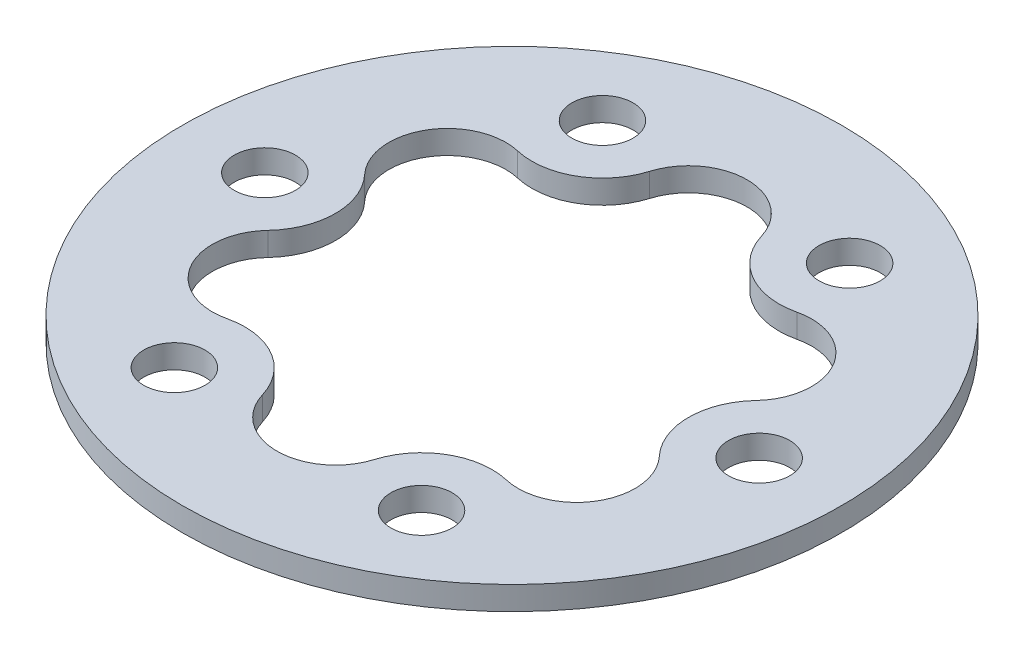
ISO-10303-21;
HEADER;
FILE_DESCRIPTION(('STEP AP214'),'2;1');
FILE_NAME('part.step','',(''),(''),'','','');
FILE_SCHEMA(('AUTOMOTIVE_DESIGN { 1 0 10303 214 1 1 1 1 }'));
ENDSEC;
DATA;
#1=APPLICATION_CONTEXT('core data for automotive mechanical design processes');
#2=APPLICATION_PROTOCOL_DEFINITION('international standard','automotive_design',2000,#1);
#3=PRODUCT_CONTEXT('',#1,'mechanical');
#4=PRODUCT('Part','Part','',(#3));
#5=PRODUCT_RELATED_PRODUCT_CATEGORY('part','',(#4));
#6=PRODUCT_DEFINITION_FORMATION('','',#4);
#7=PRODUCT_DEFINITION_CONTEXT('part definition',#1,'design');
#8=PRODUCT_DEFINITION('design','',#6,#7);
#9=PRODUCT_DEFINITION_SHAPE('','',#8);
#10=(LENGTH_UNIT() NAMED_UNIT(*) SI_UNIT(.MILLI.,.METRE.));
#11=(NAMED_UNIT(*) PLANE_ANGLE_UNIT() SI_UNIT($,.RADIAN.));
#12=(NAMED_UNIT(*) SI_UNIT($,.STERADIAN.) SOLID_ANGLE_UNIT());
#13=UNCERTAINTY_MEASURE_WITH_UNIT(LENGTH_MEASURE(1.E-05),#10,'distance_accuracy_value','');
#14=(GEOMETRIC_REPRESENTATION_CONTEXT(3) GLOBAL_UNCERTAINTY_ASSIGNED_CONTEXT((#13)) GLOBAL_UNIT_ASSIGNED_CONTEXT((#10,
#11,#12)) REPRESENTATION_CONTEXT('',''));
#15=CARTESIAN_POINT('',(0.,0.,0.));
#16=DIRECTION('',(0.,0.,1.));
#17=DIRECTION('',(1.,0.,0.));
#18=AXIS2_PLACEMENT_3D('',#15,#16,#17);
#19=CARTESIAN_POINT('',(0.,2.,0.));
#20=DIRECTION('',(0.,1.,0.));
#21=DIRECTION('',(0.,0.,1.));
#22=AXIS2_PLACEMENT_3D('',#19,#20,#21);
#23=PLANE('',#22);
#24=CARTESIAN_POINT('',(-10.5000000000001,2.,-18.1865334794733));
#25=DIRECTION('',(0.,1.,0.));
#26=DIRECTION('',(0.,0.,1.));
#27=AXIS2_PLACEMENT_3D('',#24,#25,#26);
#28=CIRCLE('',#27,2.6);
#29=CARTESIAN_POINT('',(-10.5000000000001,2.,-15.5865334794733));
#30=VERTEX_POINT('',#29);
#31=EDGE_CURVE('E230',#30,#30,#28,.T.);
#32=ORIENTED_EDGE('',*,*,#31,.F.);
#33=EDGE_LOOP('',(#32));
#34=FACE_BOUND('',#33,.T.);
#35=CARTESIAN_POINT('',(-10.5000000000001,2.,18.1865334794731));
#36=DIRECTION('',(0.,1.,0.));
#37=DIRECTION('',(0.,0.,1.));
#38=AXIS2_PLACEMENT_3D('',#35,#36,#37);
#39=CIRCLE('',#38,2.6);
#40=CARTESIAN_POINT('',(-10.5000000000001,2.,20.7865334794731));
#41=VERTEX_POINT('',#40);
#42=EDGE_CURVE('E242',#41,#41,#39,.T.);
#43=ORIENTED_EDGE('',*,*,#42,.F.);
#44=EDGE_LOOP('',(#43));
#45=FACE_BOUND('',#44,.T.);
#46=CARTESIAN_POINT('',(20.9999999999999,2.,0.));
#47=DIRECTION('',(0.,1.,0.));
#48=DIRECTION('',(0.,0.,1.));
#49=AXIS2_PLACEMENT_3D('',#46,#47,#48);
#50=CIRCLE('',#49,2.6);
#51=CARTESIAN_POINT('',(20.9999999999999,2.,2.59999999999992));
#52=VERTEX_POINT('',#51);
#53=EDGE_CURVE('E254',#52,#52,#50,.T.);
#54=ORIENTED_EDGE('',*,*,#53,.F.);
#55=EDGE_LOOP('',(#54));
#56=FACE_BOUND('',#55,.T.);
#57=CARTESIAN_POINT('',(0.,2.,0.));
#58=DIRECTION('',(0.,1.,0.));
#59=DIRECTION('',(0.,0.,1.));
#60=AXIS2_PLACEMENT_3D('',#57,#58,#59);
#61=CIRCLE('',#60,28.);
#62=CARTESIAN_POINT('',(0.,2.,28.));
#63=VERTEX_POINT('',#62);
#64=EDGE_CURVE('E11',#63,#63,#61,.T.);
#65=ORIENTED_EDGE('',*,*,#64,.T.);
#66=EDGE_LOOP('',(#65));
#67=FACE_BOUND('',#66,.T.);
#68=CARTESIAN_POINT('',(10.4999999999999,2.,-18.1865334794733));
#69=DIRECTION('',(0.,1.,0.));
#70=DIRECTION('',(0.,0.,1.));
#71=AXIS2_PLACEMENT_3D('',#68,#69,#70);
#72=CIRCLE('',#71,2.6);
#73=CARTESIAN_POINT('',(10.4999999999999,2.,-15.5865334794733));
#74=VERTEX_POINT('',#73);
#75=EDGE_CURVE('E260',#74,#74,#72,.T.);
#76=ORIENTED_EDGE('',*,*,#75,.F.);
#77=EDGE_LOOP('',(#76));
#78=FACE_BOUND('',#77,.T.);
#79=CARTESIAN_POINT('',(10.4999999999999,2.,18.1865334794731));
#80=DIRECTION('',(0.,1.,0.));
#81=DIRECTION('',(0.,0.,1.));
#82=AXIS2_PLACEMENT_3D('',#79,#80,#81);
#83=CIRCLE('',#82,2.6);
#84=CARTESIAN_POINT('',(10.4999999999999,2.,20.7865334794731));
#85=VERTEX_POINT('',#84);
#86=EDGE_CURVE('E248',#85,#85,#83,.T.);
#87=ORIENTED_EDGE('',*,*,#86,.F.);
#88=EDGE_LOOP('',(#87));
#89=FACE_BOUND('',#88,.T.);
#90=CARTESIAN_POINT('',(-21.,2.,1.2805208282618E-13));
#91=DIRECTION('',(0.,1.,0.));
#92=DIRECTION('',(0.,0.,1.));
#93=AXIS2_PLACEMENT_3D('',#90,#91,#92);
#94=CIRCLE('',#93,2.6);
#95=CARTESIAN_POINT('',(-21.,2.,2.60000000000013));
#96=VERTEX_POINT('',#95);
#97=EDGE_CURVE('E236',#96,#96,#94,.T.);
#98=ORIENTED_EDGE('',*,*,#97,.F.);
#99=EDGE_LOOP('',(#98));
#100=FACE_BOUND('',#99,.T.);
#101=CARTESIAN_POINT('',(0.,2.,-15.));
#102=DIRECTION('',(0.,1.,0.));
#103=DIRECTION('',(0.,0.,1.));
#104=AXIS2_PLACEMENT_3D('',#101,#102,#103);
#105=CIRCLE('',#104,4.97287544884218);
#106=CARTESIAN_POINT('',(4.75856966173356,2.,-16.444127765859));
#107=VERTEX_POINT('',#106);
#108=CARTESIAN_POINT('',(-4.75856979574159,2.,-16.4441273242872));
#109=VERTEX_POINT('',#108);
#110=EDGE_CURVE('E136',#107,#109,#105,.T.);
#111=ORIENTED_EDGE('',*,*,#110,.F.);
#112=CARTESIAN_POINT('',(10.4999999999999,2.,-18.1865334794733));
#113=DIRECTION('',(0.,1.,0.));
#114=DIRECTION('',(0.,0.,1.));
#115=AXIS2_PLACEMENT_3D('',#112,#113,#114);
#116=CIRCLE('',#115,6.00000000000005);
#117=CARTESIAN_POINT('',(11.8617471080276,2.,-12.3431059909372));
#118=VERTEX_POINT('',#117);
#119=EDGE_CURVE('E226',#118,#107,#116,.F.);
#120=ORIENTED_EDGE('',*,*,#119,.F.);
#121=CARTESIAN_POINT('',(12.9903810567666,2.,-7.49999999999997));
#122=DIRECTION('',(0.,1.,0.));
#123=DIRECTION('',(0.,0.,1.));
#124=AXIS2_PLACEMENT_3D('',#121,#122,#123);
#125=CIRCLE('',#124,4.97287544884214);
#126=CARTESIAN_POINT('',(16.6203172191777,2.,-4.10102167019016));
#127=VERTEX_POINT('',#126);
#128=EDGE_CURVE('E224',#127,#118,#125,.T.);
#129=ORIENTED_EDGE('',*,*,#128,.F.);
#130=CARTESIAN_POINT('',(21.,2.,0.));
#131=DIRECTION('',(0.,1.,0.));
#132=DIRECTION('',(0.,0.,1.));
#133=AXIS2_PLACEMENT_3D('',#130,#131,#132);
#134=CIRCLE('',#133,6.00000000000014);
#135=CARTESIAN_POINT('',(16.6203169037692,2.,4.10102133334997));
#136=VERTEX_POINT('',#135);
#137=EDGE_CURVE('E222',#136,#127,#134,.F.);
#138=ORIENTED_EDGE('',*,*,#137,.F.);
#139=CARTESIAN_POINT('',(12.9903810567665,2.,7.50000000000006));
#140=DIRECTION('',(0.,1.,0.));
#141=DIRECTION('',(0.,0.,1.));
#142=AXIS2_PLACEMENT_3D('',#139,#140,#141);
#143=CIRCLE('',#142,4.97287544884212);
#144=CARTESIAN_POINT('',(11.8617475574439,2.,12.3431060956688));
#145=VERTEX_POINT('',#144);
#146=EDGE_CURVE('E220',#145,#136,#143,.T.);
#147=ORIENTED_EDGE('',*,*,#146,.F.);
#148=CARTESIAN_POINT('',(10.5,2.,18.1865334794732));
#149=DIRECTION('',(0.,1.,0.));
#150=DIRECTION('',(0.,0.,1.));
#151=AXIS2_PLACEMENT_3D('',#148,#149,#150);
#152=CIRCLE('',#151,6.00000000000014);
#153=CARTESIAN_POINT('',(4.75856979574155,2.,16.4441273242872));
#154=VERTEX_POINT('',#153);
#155=EDGE_CURVE('E218',#154,#145,#152,.F.);
#156=ORIENTED_EDGE('',*,*,#155,.F.);
#157=CARTESIAN_POINT('',(-1.04517089427603E-13,2.,15.));
#158=DIRECTION('',(0.,1.,0.));
#159=DIRECTION('',(0.,0.,1.));
#160=AXIS2_PLACEMENT_3D('',#157,#158,#159);
#161=CIRCLE('',#160,4.97287544884213);
#162=CARTESIAN_POINT('',(-4.75856966173379,2.,16.4441277658589));
#163=VERTEX_POINT('',#162);
#164=EDGE_CURVE('E216',#163,#154,#161,.T.);
#165=ORIENTED_EDGE('',*,*,#164,.F.);
#166=CARTESIAN_POINT('',(-10.5,2.,18.1865334794732));
#167=DIRECTION('',(0.,1.,0.));
#168=DIRECTION('',(0.,0.,1.));
#169=AXIS2_PLACEMENT_3D('',#166,#167,#168);
#170=CIRCLE('',#169,6.00000000000005);
#171=CARTESIAN_POINT('',(-11.8617471080278,2.,12.3431059909372));
#172=VERTEX_POINT('',#171);
#173=EDGE_CURVE('E214',#172,#163,#170,.F.);
#174=ORIENTED_EDGE('',*,*,#173,.F.);
#175=CARTESIAN_POINT('',(-12.9903810567667,2.,7.49999999999988));
#176=DIRECTION('',(0.,1.,0.));
#177=DIRECTION('',(0.,0.,1.));
#178=AXIS2_PLACEMENT_3D('',#175,#176,#177);
#179=CIRCLE('',#178,4.97287544884218);
#180=CARTESIAN_POINT('',(-16.6203172191779,2.,4.10102167019011));
#181=VERTEX_POINT('',#180);
#182=EDGE_CURVE('E212',#181,#172,#179,.T.);
#183=ORIENTED_EDGE('',*,*,#182,.F.);
#184=CARTESIAN_POINT('',(-21.,2.,0.));
#185=DIRECTION('',(0.,1.,0.));
#186=DIRECTION('',(0.,0.,1.));
#187=AXIS2_PLACEMENT_3D('',#184,#185,#186);
#188=CIRCLE('',#187,5.99999999999997);
#189=CARTESIAN_POINT('',(-16.6203169037695,2.,-4.10102133335012));
#190=VERTEX_POINT('',#189);
#191=EDGE_CURVE('E210',#190,#181,#188,.F.);
#192=ORIENTED_EDGE('',*,*,#191,.F.);
#193=CARTESIAN_POINT('',(-12.9903810567665,2.,-7.50000000000015));
#194=DIRECTION('',(0.,1.,0.));
#195=DIRECTION('',(0.,0.,1.));
#196=AXIS2_PLACEMENT_3D('',#193,#194,#195);
#197=CIRCLE('',#196,4.97287544884219);
#198=CARTESIAN_POINT('',(-11.8617475574442,2.,-12.343106095669));
#199=VERTEX_POINT('',#198);
#200=EDGE_CURVE('E208',#199,#190,#197,.T.);
#201=ORIENTED_EDGE('',*,*,#200,.F.);
#202=CARTESIAN_POINT('',(-10.4999999999999,2.,-18.1865334794733));
#203=DIRECTION('',(0.,1.,0.));
#204=DIRECTION('',(0.,0.,1.));
#205=AXIS2_PLACEMENT_3D('',#202,#203,#204);
#206=CIRCLE('',#205,5.99999999999997);
#207=EDGE_CURVE('E178',#109,#199,#206,.F.);
#208=ORIENTED_EDGE('',*,*,#207,.F.);
#209=EDGE_LOOP('',(#111,#120,#129,#138,#147,#156,#165,#174,#183,#192,#201,#208));
#210=FACE_BOUND('',#209,.T.);
#211=ADVANCED_FACE('F41',(#34,#45,#56,#67,#78,#89,#100,#210),#23,.T.);
#212=CARTESIAN_POINT('',(0.,0.,0.));
#213=DIRECTION('',(0.,1.,0.));
#214=DIRECTION('',(0.,0.,1.));
#215=AXIS2_PLACEMENT_3D('',#212,#213,#214);
#216=PLANE('',#215);
#217=CARTESIAN_POINT('',(0.,0.,0.));
#218=DIRECTION('',(0.,1.,0.));
#219=DIRECTION('',(0.,0.,1.));
#220=AXIS2_PLACEMENT_3D('',#217,#218,#219);
#221=CIRCLE('',#220,28.);
#222=CARTESIAN_POINT('',(0.,0.,28.));
#223=VERTEX_POINT('',#222);
#224=EDGE_CURVE('E45',#223,#223,#221,.T.);
#225=ORIENTED_EDGE('',*,*,#224,.F.);
#226=EDGE_LOOP('',(#225));
#227=FACE_BOUND('',#226,.T.);
#228=CARTESIAN_POINT('',(10.4999999999999,0.,-18.1865334794733));
#229=DIRECTION('',(0.,1.,0.));
#230=DIRECTION('',(0.,0.,1.));
#231=AXIS2_PLACEMENT_3D('',#228,#229,#230);
#232=CIRCLE('',#231,2.6);
#233=CARTESIAN_POINT('',(10.4999999999999,0.,-15.5865334794733));
#234=VERTEX_POINT('',#233);
#235=EDGE_CURVE('E257',#234,#234,#232,.T.);
#236=ORIENTED_EDGE('',*,*,#235,.T.);
#237=EDGE_LOOP('',(#236));
#238=FACE_BOUND('',#237,.T.);
#239=CARTESIAN_POINT('',(20.9999999999999,0.,0.));
#240=DIRECTION('',(0.,1.,0.));
#241=DIRECTION('',(0.,0.,1.));
#242=AXIS2_PLACEMENT_3D('',#239,#240,#241);
#243=CIRCLE('',#242,2.6);
#244=CARTESIAN_POINT('',(20.9999999999999,0.,2.59999999999992));
#245=VERTEX_POINT('',#244);
#246=EDGE_CURVE('E251',#245,#245,#243,.T.);
#247=ORIENTED_EDGE('',*,*,#246,.T.);
#248=EDGE_LOOP('',(#247));
#249=FACE_BOUND('',#248,.T.);
#250=CARTESIAN_POINT('',(10.4999999999999,0.,18.1865334794731));
#251=DIRECTION('',(0.,1.,0.));
#252=DIRECTION('',(0.,0.,1.));
#253=AXIS2_PLACEMENT_3D('',#250,#251,#252);
#254=CIRCLE('',#253,2.6);
#255=CARTESIAN_POINT('',(10.4999999999999,0.,20.7865334794731));
#256=VERTEX_POINT('',#255);
#257=EDGE_CURVE('E245',#256,#256,#254,.T.);
#258=ORIENTED_EDGE('',*,*,#257,.T.);
#259=EDGE_LOOP('',(#258));
#260=FACE_BOUND('',#259,.T.);
#261=CARTESIAN_POINT('',(-10.5000000000001,0.,18.1865334794731));
#262=DIRECTION('',(0.,1.,0.));
#263=DIRECTION('',(0.,0.,1.));
#264=AXIS2_PLACEMENT_3D('',#261,#262,#263);
#265=CIRCLE('',#264,2.6);
#266=CARTESIAN_POINT('',(-10.5000000000001,0.,20.7865334794731));
#267=VERTEX_POINT('',#266);
#268=EDGE_CURVE('E239',#267,#267,#265,.T.);
#269=ORIENTED_EDGE('',*,*,#268,.T.);
#270=EDGE_LOOP('',(#269));
#271=FACE_BOUND('',#270,.T.);
#272=CARTESIAN_POINT('',(-21.,0.,1.2805208282618E-13));
#273=DIRECTION('',(0.,1.,0.));
#274=DIRECTION('',(0.,0.,1.));
#275=AXIS2_PLACEMENT_3D('',#272,#273,#274);
#276=CIRCLE('',#275,2.6);
#277=CARTESIAN_POINT('',(-21.,0.,2.60000000000013));
#278=VERTEX_POINT('',#277);
#279=EDGE_CURVE('E233',#278,#278,#276,.T.);
#280=ORIENTED_EDGE('',*,*,#279,.T.);
#281=EDGE_LOOP('',(#280));
#282=FACE_BOUND('',#281,.T.);
#283=CARTESIAN_POINT('',(-10.5000000000001,0.,-18.1865334794733));
#284=DIRECTION('',(0.,1.,0.));
#285=DIRECTION('',(0.,0.,1.));
#286=AXIS2_PLACEMENT_3D('',#283,#284,#285);
#287=CIRCLE('',#286,2.6);
#288=CARTESIAN_POINT('',(-10.5000000000001,0.,-15.5865334794733));
#289=VERTEX_POINT('',#288);
#290=EDGE_CURVE('E229',#289,#289,#287,.T.);
#291=ORIENTED_EDGE('',*,*,#290,.T.);
#292=EDGE_LOOP('',(#291));
#293=FACE_BOUND('',#292,.T.);
#294=CARTESIAN_POINT('',(10.4999999999999,0.,-18.1865334794733));
#295=DIRECTION('',(0.,-1.,0.));
#296=DIRECTION('',(0.,0.,1.));
#297=AXIS2_PLACEMENT_3D('',#294,#295,#296);
#298=CIRCLE('',#297,6.00000000000005);
#299=CARTESIAN_POINT('',(11.8617471080276,0.,-12.3431059909372));
#300=VERTEX_POINT('',#299);
#301=CARTESIAN_POINT('',(4.75856966173356,0.,-16.444127765859));
#302=VERTEX_POINT('',#301);
#303=EDGE_CURVE('E139',#300,#302,#298,.T.);
#304=ORIENTED_EDGE('',*,*,#303,.T.);
#305=CARTESIAN_POINT('',(0.,0.,-15.));
#306=DIRECTION('',(0.,1.,0.));
#307=DIRECTION('',(0.,0.,-1.));
#308=AXIS2_PLACEMENT_3D('',#305,#306,#307);
#309=CIRCLE('',#308,4.97287544884218);
#310=CARTESIAN_POINT('',(-4.75856979574159,0.,-16.4441273242872));
#311=VERTEX_POINT('',#310);
#312=EDGE_CURVE('E133',#302,#311,#309,.T.);
#313=ORIENTED_EDGE('',*,*,#312,.T.);
#314=CARTESIAN_POINT('',(-10.4999999999999,0.,-18.1865334794733));
#315=DIRECTION('',(0.,-1.,0.));
#316=DIRECTION('',(0.,0.,1.));
#317=AXIS2_PLACEMENT_3D('',#314,#315,#316);
#318=CIRCLE('',#317,5.99999999999997);
#319=CARTESIAN_POINT('',(-11.8617475574442,0.,-12.343106095669));
#320=VERTEX_POINT('',#319);
#321=EDGE_CURVE('E142',#311,#320,#318,.T.);
#322=ORIENTED_EDGE('',*,*,#321,.T.);
#323=CARTESIAN_POINT('',(-12.9903810567665,0.,-7.50000000000015));
#324=DIRECTION('',(0.,1.,0.));
#325=DIRECTION('',(0.,0.,-1.));
#326=AXIS2_PLACEMENT_3D('',#323,#324,#325);
#327=CIRCLE('',#326,4.97287544884219);
#328=CARTESIAN_POINT('',(-16.6203169037695,0.,-4.10102133335012));
#329=VERTEX_POINT('',#328);
#330=EDGE_CURVE('E64',#320,#329,#327,.T.);
#331=ORIENTED_EDGE('',*,*,#330,.T.);
#332=CARTESIAN_POINT('',(-21.,0.,0.));
#333=DIRECTION('',(0.,-1.,0.));
#334=DIRECTION('',(0.,0.,1.));
#335=AXIS2_PLACEMENT_3D('',#332,#333,#334);
#336=CIRCLE('',#335,5.99999999999997);
#337=CARTESIAN_POINT('',(-16.6203172191779,0.,4.10102167019011));
#338=VERTEX_POINT('',#337);
#339=EDGE_CURVE('E152',#329,#338,#336,.T.);
#340=ORIENTED_EDGE('',*,*,#339,.T.);
#341=CARTESIAN_POINT('',(-12.9903810567667,0.,7.49999999999988));
#342=DIRECTION('',(0.,1.,0.));
#343=DIRECTION('',(0.,0.,-1.));
#344=AXIS2_PLACEMENT_3D('',#341,#342,#343);
#345=CIRCLE('',#344,4.97287544884218);
#346=CARTESIAN_POINT('',(-11.8617471080278,0.,12.3431059909372));
#347=VERTEX_POINT('',#346);
#348=EDGE_CURVE('E155',#338,#347,#345,.T.);
#349=ORIENTED_EDGE('',*,*,#348,.T.);
#350=CARTESIAN_POINT('',(-10.5,0.,18.1865334794732));
#351=DIRECTION('',(0.,-1.,0.));
#352=DIRECTION('',(0.,0.,1.));
#353=AXIS2_PLACEMENT_3D('',#350,#351,#352);
#354=CIRCLE('',#353,6.00000000000005);
#355=CARTESIAN_POINT('',(-4.75856966173379,0.,16.4441277658589));
#356=VERTEX_POINT('',#355);
#357=EDGE_CURVE('E158',#347,#356,#354,.T.);
#358=ORIENTED_EDGE('',*,*,#357,.T.);
#359=CARTESIAN_POINT('',(-1.04517089427603E-13,0.,15.));
#360=DIRECTION('',(0.,1.,0.));
#361=DIRECTION('',(0.,0.,-1.));
#362=AXIS2_PLACEMENT_3D('',#359,#360,#361);
#363=CIRCLE('',#362,4.97287544884213);
#364=CARTESIAN_POINT('',(4.75856979574155,0.,16.4441273242872));
#365=VERTEX_POINT('',#364);
#366=EDGE_CURVE('E161',#356,#365,#363,.T.);
#367=ORIENTED_EDGE('',*,*,#366,.T.);
#368=CARTESIAN_POINT('',(10.5,0.,18.1865334794732));
#369=DIRECTION('',(0.,-1.,0.));
#370=DIRECTION('',(0.,0.,1.));
#371=AXIS2_PLACEMENT_3D('',#368,#369,#370);
#372=CIRCLE('',#371,6.00000000000014);
#373=CARTESIAN_POINT('',(11.8617475574439,0.,12.3431060956688));
#374=VERTEX_POINT('',#373);
#375=EDGE_CURVE('E164',#365,#374,#372,.T.);
#376=ORIENTED_EDGE('',*,*,#375,.T.);
#377=CARTESIAN_POINT('',(12.9903810567665,0.,7.50000000000006));
#378=DIRECTION('',(0.,1.,0.));
#379=DIRECTION('',(0.,0.,-1.));
#380=AXIS2_PLACEMENT_3D('',#377,#378,#379);
#381=CIRCLE('',#380,4.97287544884212);
#382=CARTESIAN_POINT('',(16.6203169037692,0.,4.10102133334997));
#383=VERTEX_POINT('',#382);
#384=EDGE_CURVE('E167',#374,#383,#381,.T.);
#385=ORIENTED_EDGE('',*,*,#384,.T.);
#386=CARTESIAN_POINT('',(21.,0.,0.));
#387=DIRECTION('',(0.,-1.,0.));
#388=DIRECTION('',(0.,0.,1.));
#389=AXIS2_PLACEMENT_3D('',#386,#387,#388);
#390=CIRCLE('',#389,6.00000000000014);
#391=CARTESIAN_POINT('',(16.6203172191777,0.,-4.10102167019016));
#392=VERTEX_POINT('',#391);
#393=EDGE_CURVE('E170',#383,#392,#390,.T.);
#394=ORIENTED_EDGE('',*,*,#393,.T.);
#395=CARTESIAN_POINT('',(12.9903810567666,0.,-7.49999999999997));
#396=DIRECTION('',(0.,1.,0.));
#397=DIRECTION('',(0.,0.,-1.));
#398=AXIS2_PLACEMENT_3D('',#395,#396,#397);
#399=CIRCLE('',#398,4.97287544884214);
#400=EDGE_CURVE('E173',#392,#300,#399,.T.);
#401=ORIENTED_EDGE('',*,*,#400,.T.);
#402=EDGE_LOOP('',(#304,#313,#322,#331,#340,#349,#358,#367,#376,#385,#394,#401));
#403=FACE_BOUND('',#402,.T.);
#404=ADVANCED_FACE('F146',(#227,#238,#249,#260,#271,#282,#293,#403),#216,.F.);
#405=CARTESIAN_POINT('',(0.,2.,0.));
#406=DIRECTION('',(0.,-1.,0.));
#407=DIRECTION('',(0.,0.,-1.));
#408=AXIS2_PLACEMENT_3D('',#405,#406,#407);
#409=CYLINDRICAL_SURFACE('',#408,28.);
#410=ORIENTED_EDGE('',*,*,#64,.F.);
#411=EDGE_LOOP('',(#410));
#412=FACE_BOUND('',#411,.T.);
#413=ORIENTED_EDGE('',*,*,#224,.T.);
#414=EDGE_LOOP('',(#413));
#415=FACE_BOUND('',#414,.T.);
#416=ADVANCED_FACE('F43',(#412,#415),#409,.T.);
#417=CARTESIAN_POINT('',(10.4999999999999,2.,-18.1865334794733));
#418=DIRECTION('',(0.,-1.,0.));
#419=DIRECTION('',(0.,0.,-1.));
#420=AXIS2_PLACEMENT_3D('',#417,#418,#419);
#421=CYLINDRICAL_SURFACE('',#420,2.6);
#422=ORIENTED_EDGE('',*,*,#75,.T.);
#423=EDGE_LOOP('',(#422));
#424=FACE_BOUND('',#423,.T.);
#425=ORIENTED_EDGE('',*,*,#235,.F.);
#426=EDGE_LOOP('',(#425));
#427=FACE_BOUND('',#426,.T.);
#428=ADVANCED_FACE('F268',(#424,#427),#421,.F.);
#429=CARTESIAN_POINT('',(20.9999999999999,2.,0.));
#430=DIRECTION('',(0.,-1.,0.));
#431=DIRECTION('',(0.,0.,-1.));
#432=AXIS2_PLACEMENT_3D('',#429,#430,#431);
#433=CYLINDRICAL_SURFACE('',#432,2.6);
#434=ORIENTED_EDGE('',*,*,#53,.T.);
#435=EDGE_LOOP('',(#434));
#436=FACE_BOUND('',#435,.T.);
#437=ORIENTED_EDGE('',*,*,#246,.F.);
#438=EDGE_LOOP('',(#437));
#439=FACE_BOUND('',#438,.T.);
#440=ADVANCED_FACE('F270',(#436,#439),#433,.F.);
#441=CARTESIAN_POINT('',(10.4999999999999,2.,18.1865334794731));
#442=DIRECTION('',(0.,-1.,0.));
#443=DIRECTION('',(0.,0.,-1.));
#444=AXIS2_PLACEMENT_3D('',#441,#442,#443);
#445=CYLINDRICAL_SURFACE('',#444,2.6);
#446=ORIENTED_EDGE('',*,*,#86,.T.);
#447=EDGE_LOOP('',(#446));
#448=FACE_BOUND('',#447,.T.);
#449=ORIENTED_EDGE('',*,*,#257,.F.);
#450=EDGE_LOOP('',(#449));
#451=FACE_BOUND('',#450,.T.);
#452=ADVANCED_FACE('F277',(#448,#451),#445,.F.);
#453=CARTESIAN_POINT('',(-10.5000000000001,2.,18.1865334794731));
#454=DIRECTION('',(0.,-1.,0.));
#455=DIRECTION('',(0.,0.,-1.));
#456=AXIS2_PLACEMENT_3D('',#453,#454,#455);
#457=CYLINDRICAL_SURFACE('',#456,2.6);
#458=ORIENTED_EDGE('',*,*,#42,.T.);
#459=EDGE_LOOP('',(#458));
#460=FACE_BOUND('',#459,.T.);
#461=ORIENTED_EDGE('',*,*,#268,.F.);
#462=EDGE_LOOP('',(#461));
#463=FACE_BOUND('',#462,.T.);
#464=ADVANCED_FACE('F374',(#460,#463),#457,.F.);
#465=CARTESIAN_POINT('',(-21.,2.,1.2805208282618E-13));
#466=DIRECTION('',(0.,-1.,0.));
#467=DIRECTION('',(0.,0.,-1.));
#468=AXIS2_PLACEMENT_3D('',#465,#466,#467);
#469=CYLINDRICAL_SURFACE('',#468,2.6);
#470=ORIENTED_EDGE('',*,*,#97,.T.);
#471=EDGE_LOOP('',(#470));
#472=FACE_BOUND('',#471,.T.);
#473=ORIENTED_EDGE('',*,*,#279,.F.);
#474=EDGE_LOOP('',(#473));
#475=FACE_BOUND('',#474,.T.);
#476=ADVANCED_FACE('F370',(#472,#475),#469,.F.);
#477=CARTESIAN_POINT('',(-10.5000000000001,2.,-18.1865334794733));
#478=DIRECTION('',(0.,-1.,0.));
#479=DIRECTION('',(0.,0.,-1.));
#480=AXIS2_PLACEMENT_3D('',#477,#478,#479);
#481=CYLINDRICAL_SURFACE('',#480,2.6);
#482=ORIENTED_EDGE('',*,*,#31,.T.);
#483=EDGE_LOOP('',(#482));
#484=FACE_BOUND('',#483,.T.);
#485=ORIENTED_EDGE('',*,*,#290,.F.);
#486=EDGE_LOOP('',(#485));
#487=FACE_BOUND('',#486,.T.);
#488=ADVANCED_FACE('F348',(#484,#487),#481,.F.);
#489=CARTESIAN_POINT('',(0.,0.,-15.));
#490=DIRECTION('',(0.,1.,0.));
#491=DIRECTION('',(0.,0.,1.));
#492=AXIS2_PLACEMENT_3D('',#489,#490,#491);
#493=CYLINDRICAL_SURFACE('',#492,4.97287544884218);
#494=ORIENTED_EDGE('',*,*,#110,.T.);
#495=DIRECTION('',(0.,1.,0.));
#496=VECTOR('',#495,1.);
#497=CARTESIAN_POINT('',(-4.75856979574159,0.,-16.4441273242872));
#498=LINE('',#497,#496);
#499=EDGE_CURVE('E56',#311,#109,#498,.T.);
#500=ORIENTED_EDGE('',*,*,#499,.F.);
#501=ORIENTED_EDGE('',*,*,#312,.F.);
#502=DIRECTION('',(0.,1.,0.));
#503=VECTOR('',#502,1.);
#504=CARTESIAN_POINT('',(4.75856966173356,0.,-16.444127765859));
#505=LINE('',#504,#503);
#506=EDGE_CURVE('E176',#302,#107,#505,.T.);
#507=ORIENTED_EDGE('',*,*,#506,.T.);
#508=EDGE_LOOP('',(#494,#500,#501,#507));
#509=FACE_BOUND('',#508,.T.);
#510=ADVANCED_FACE('F130',(#509),#493,.F.);
#511=CARTESIAN_POINT('',(10.4999999999999,0.,-18.1865334794733));
#512=DIRECTION('',(0.,1.,0.));
#513=DIRECTION('',(0.,0.,1.));
#514=AXIS2_PLACEMENT_3D('',#511,#512,#513);
#515=CYLINDRICAL_SURFACE('',#514,6.00000000000005);
#516=ORIENTED_EDGE('',*,*,#119,.T.);
#517=ORIENTED_EDGE('',*,*,#506,.F.);
#518=ORIENTED_EDGE('',*,*,#303,.F.);
#519=DIRECTION('',(0.,1.,0.));
#520=VECTOR('',#519,1.);
#521=CARTESIAN_POINT('',(11.8617471080276,0.,-12.3431059909372));
#522=LINE('',#521,#520);
#523=EDGE_CURVE('E179',#300,#118,#522,.T.);
#524=ORIENTED_EDGE('',*,*,#523,.T.);
#525=EDGE_LOOP('',(#516,#517,#518,#524));
#526=FACE_BOUND('',#525,.T.);
#527=ADVANCED_FACE('F340',(#526),#515,.T.);
#528=CARTESIAN_POINT('',(12.9903810567666,0.,-7.49999999999997));
#529=DIRECTION('',(0.,1.,0.));
#530=DIRECTION('',(0.,0.,1.));
#531=AXIS2_PLACEMENT_3D('',#528,#529,#530);
#532=CYLINDRICAL_SURFACE('',#531,4.97287544884214);
#533=ORIENTED_EDGE('',*,*,#128,.T.);
#534=ORIENTED_EDGE('',*,*,#523,.F.);
#535=ORIENTED_EDGE('',*,*,#400,.F.);
#536=DIRECTION('',(0.,1.,0.));
#537=VECTOR('',#536,1.);
#538=CARTESIAN_POINT('',(16.6203172191777,0.,-4.10102167019016));
#539=LINE('',#538,#537);
#540=EDGE_CURVE('E182',#392,#127,#539,.T.);
#541=ORIENTED_EDGE('',*,*,#540,.T.);
#542=EDGE_LOOP('',(#533,#534,#535,#541));
#543=FACE_BOUND('',#542,.T.);
#544=ADVANCED_FACE('F338',(#543),#532,.F.);
#545=CARTESIAN_POINT('',(21.,0.,0.));
#546=DIRECTION('',(0.,1.,0.));
#547=DIRECTION('',(0.,0.,1.));
#548=AXIS2_PLACEMENT_3D('',#545,#546,#547);
#549=CYLINDRICAL_SURFACE('',#548,6.00000000000014);
#550=ORIENTED_EDGE('',*,*,#137,.T.);
#551=ORIENTED_EDGE('',*,*,#540,.F.);
#552=ORIENTED_EDGE('',*,*,#393,.F.);
#553=DIRECTION('',(0.,1.,0.));
#554=VECTOR('',#553,1.);
#555=CARTESIAN_POINT('',(16.6203169037692,0.,4.10102133334997));
#556=LINE('',#555,#554);
#557=EDGE_CURVE('E185',#383,#136,#556,.T.);
#558=ORIENTED_EDGE('',*,*,#557,.T.);
#559=EDGE_LOOP('',(#550,#551,#552,#558));
#560=FACE_BOUND('',#559,.T.);
#561=ADVANCED_FACE('F335',(#560),#549,.T.);
#562=CARTESIAN_POINT('',(12.9903810567665,0.,7.50000000000006));
#563=DIRECTION('',(0.,1.,0.));
#564=DIRECTION('',(0.,0.,1.));
#565=AXIS2_PLACEMENT_3D('',#562,#563,#564);
#566=CYLINDRICAL_SURFACE('',#565,4.97287544884212);
#567=ORIENTED_EDGE('',*,*,#146,.T.);
#568=ORIENTED_EDGE('',*,*,#557,.F.);
#569=ORIENTED_EDGE('',*,*,#384,.F.);
#570=DIRECTION('',(0.,1.,0.));
#571=VECTOR('',#570,1.);
#572=CARTESIAN_POINT('',(11.8617475574439,0.,12.3431060956688));
#573=LINE('',#572,#571);
#574=EDGE_CURVE('E188',#374,#145,#573,.T.);
#575=ORIENTED_EDGE('',*,*,#574,.T.);
#576=EDGE_LOOP('',(#567,#568,#569,#575));
#577=FACE_BOUND('',#576,.T.);
#578=ADVANCED_FACE('F331',(#577),#566,.F.);
#579=CARTESIAN_POINT('',(10.5,0.,18.1865334794732));
#580=DIRECTION('',(0.,1.,0.));
#581=DIRECTION('',(0.,0.,1.));
#582=AXIS2_PLACEMENT_3D('',#579,#580,#581);
#583=CYLINDRICAL_SURFACE('',#582,6.00000000000014);
#584=ORIENTED_EDGE('',*,*,#155,.T.);
#585=ORIENTED_EDGE('',*,*,#574,.F.);
#586=ORIENTED_EDGE('',*,*,#375,.F.);
#587=DIRECTION('',(0.,1.,0.));
#588=VECTOR('',#587,1.);
#589=CARTESIAN_POINT('',(4.75856979574155,0.,16.4441273242872));
#590=LINE('',#589,#588);
#591=EDGE_CURVE('E191',#365,#154,#590,.T.);
#592=ORIENTED_EDGE('',*,*,#591,.T.);
#593=EDGE_LOOP('',(#584,#585,#586,#592));
#594=FACE_BOUND('',#593,.T.);
#595=ADVANCED_FACE('F327',(#594),#583,.T.);
#596=CARTESIAN_POINT('',(-1.04517089427603E-13,0.,15.));
#597=DIRECTION('',(0.,1.,0.));
#598=DIRECTION('',(0.,0.,1.));
#599=AXIS2_PLACEMENT_3D('',#596,#597,#598);
#600=CYLINDRICAL_SURFACE('',#599,4.97287544884213);
#601=ORIENTED_EDGE('',*,*,#164,.T.);
#602=ORIENTED_EDGE('',*,*,#591,.F.);
#603=ORIENTED_EDGE('',*,*,#366,.F.);
#604=DIRECTION('',(0.,1.,0.));
#605=VECTOR('',#604,1.);
#606=CARTESIAN_POINT('',(-4.75856966173379,0.,16.4441277658589));
#607=LINE('',#606,#605);
#608=EDGE_CURVE('E194',#356,#163,#607,.T.);
#609=ORIENTED_EDGE('',*,*,#608,.T.);
#610=EDGE_LOOP('',(#601,#602,#603,#609));
#611=FACE_BOUND('',#610,.T.);
#612=ADVANCED_FACE('F324',(#611),#600,.F.);
#613=CARTESIAN_POINT('',(-10.5,0.,18.1865334794732));
#614=DIRECTION('',(0.,1.,0.));
#615=DIRECTION('',(0.,0.,1.));
#616=AXIS2_PLACEMENT_3D('',#613,#614,#615);
#617=CYLINDRICAL_SURFACE('',#616,6.00000000000005);
#618=ORIENTED_EDGE('',*,*,#173,.T.);
#619=ORIENTED_EDGE('',*,*,#608,.F.);
#620=ORIENTED_EDGE('',*,*,#357,.F.);
#621=DIRECTION('',(0.,1.,0.));
#622=VECTOR('',#621,1.);
#623=CARTESIAN_POINT('',(-11.8617471080278,0.,12.3431059909372));
#624=LINE('',#623,#622);
#625=EDGE_CURVE('E197',#347,#172,#624,.T.);
#626=ORIENTED_EDGE('',*,*,#625,.T.);
#627=EDGE_LOOP('',(#618,#619,#620,#626));
#628=FACE_BOUND('',#627,.T.);
#629=ADVANCED_FACE('F320',(#628),#617,.T.);
#630=CARTESIAN_POINT('',(-12.9903810567667,0.,7.49999999999988));
#631=DIRECTION('',(0.,1.,0.));
#632=DIRECTION('',(0.,0.,1.));
#633=AXIS2_PLACEMENT_3D('',#630,#631,#632);
#634=CYLINDRICAL_SURFACE('',#633,4.97287544884218);
#635=ORIENTED_EDGE('',*,*,#182,.T.);
#636=ORIENTED_EDGE('',*,*,#625,.F.);
#637=ORIENTED_EDGE('',*,*,#348,.F.);
#638=DIRECTION('',(0.,1.,0.));
#639=VECTOR('',#638,1.);
#640=CARTESIAN_POINT('',(-16.6203172191779,0.,4.10102167019011));
#641=LINE('',#640,#639);
#642=EDGE_CURVE('E200',#338,#181,#641,.T.);
#643=ORIENTED_EDGE('',*,*,#642,.T.);
#644=EDGE_LOOP('',(#635,#636,#637,#643));
#645=FACE_BOUND('',#644,.T.);
#646=ADVANCED_FACE('F316',(#645),#634,.F.);
#647=CARTESIAN_POINT('',(-21.,0.,0.));
#648=DIRECTION('',(0.,1.,0.));
#649=DIRECTION('',(0.,0.,1.));
#650=AXIS2_PLACEMENT_3D('',#647,#648,#649);
#651=CYLINDRICAL_SURFACE('',#650,5.99999999999997);
#652=ORIENTED_EDGE('',*,*,#191,.T.);
#653=ORIENTED_EDGE('',*,*,#642,.F.);
#654=ORIENTED_EDGE('',*,*,#339,.F.);
#655=DIRECTION('',(0.,1.,0.));
#656=VECTOR('',#655,1.);
#657=CARTESIAN_POINT('',(-16.6203169037695,0.,-4.10102133335012));
#658=LINE('',#657,#656);
#659=EDGE_CURVE('E203',#329,#190,#658,.T.);
#660=ORIENTED_EDGE('',*,*,#659,.T.);
#661=EDGE_LOOP('',(#652,#653,#654,#660));
#662=FACE_BOUND('',#661,.T.);
#663=ADVANCED_FACE('F311',(#662),#651,.T.);
#664=CARTESIAN_POINT('',(-12.9903810567665,0.,-7.50000000000015));
#665=DIRECTION('',(0.,1.,0.));
#666=DIRECTION('',(0.,0.,1.));
#667=AXIS2_PLACEMENT_3D('',#664,#665,#666);
#668=CYLINDRICAL_SURFACE('',#667,4.97287544884219);
#669=ORIENTED_EDGE('',*,*,#200,.T.);
#670=ORIENTED_EDGE('',*,*,#659,.F.);
#671=ORIENTED_EDGE('',*,*,#330,.F.);
#672=DIRECTION('',(0.,1.,0.));
#673=VECTOR('',#672,1.);
#674=CARTESIAN_POINT('',(-11.8617475574442,0.,-12.343106095669));
#675=LINE('',#674,#673);
#676=EDGE_CURVE('E138',#320,#199,#675,.T.);
#677=ORIENTED_EDGE('',*,*,#676,.T.);
#678=EDGE_LOOP('',(#669,#670,#671,#677));
#679=FACE_BOUND('',#678,.T.);
#680=ADVANCED_FACE('F308',(#679),#668,.F.);
#681=CARTESIAN_POINT('',(-10.4999999999999,0.,-18.1865334794733));
#682=DIRECTION('',(0.,1.,0.));
#683=DIRECTION('',(0.,0.,1.));
#684=AXIS2_PLACEMENT_3D('',#681,#682,#683);
#685=CYLINDRICAL_SURFACE('',#684,5.99999999999997);
#686=ORIENTED_EDGE('',*,*,#207,.T.);
#687=ORIENTED_EDGE('',*,*,#676,.F.);
#688=ORIENTED_EDGE('',*,*,#321,.F.);
#689=ORIENTED_EDGE('',*,*,#499,.T.);
#690=EDGE_LOOP('',(#686,#687,#688,#689));
#691=FACE_BOUND('',#690,.T.);
#692=ADVANCED_FACE('F143',(#691),#685,.T.);
#693=CLOSED_SHELL('',(#211,#404,#416,#428,#440,#452,#464,#476,#488,#510,#527,#544,#561,#578,
#595,#612,#629,#646,#663,#680,#692));
#694=MANIFOLD_SOLID_BREP('B2',#693);
#695=ADVANCED_BREP_SHAPE_REPRESENTATION('',(#18,#694),#14);
#696=SHAPE_DEFINITION_REPRESENTATION(#9,#695);
ENDSEC;
END-ISO-10303-21;
